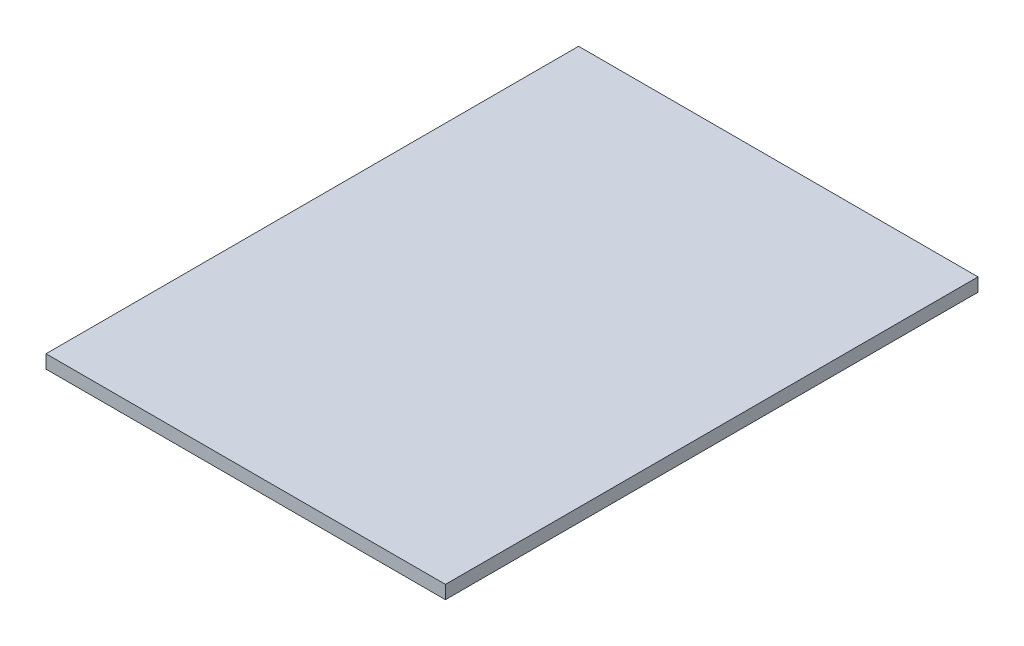
ISO-10303-21;
HEADER;
FILE_DESCRIPTION(('STEP AP214'),'2;1');
FILE_NAME('part.step','',(''),(''),'','','');
FILE_SCHEMA(('AUTOMOTIVE_DESIGN { 1 0 10303 214 1 1 1 1 }'));
ENDSEC;
DATA;
#1=APPLICATION_CONTEXT('core data for automotive mechanical design processes');
#2=APPLICATION_PROTOCOL_DEFINITION('international standard','automotive_design',2000,#1);
#3=PRODUCT_CONTEXT('',#1,'mechanical');
#4=PRODUCT('Part','Part','',(#3));
#5=PRODUCT_RELATED_PRODUCT_CATEGORY('part','',(#4));
#6=PRODUCT_DEFINITION_FORMATION('','',#4);
#7=PRODUCT_DEFINITION_CONTEXT('part definition',#1,'design');
#8=PRODUCT_DEFINITION('design','',#6,#7);
#9=PRODUCT_DEFINITION_SHAPE('','',#8);
#10=(LENGTH_UNIT() NAMED_UNIT(*) SI_UNIT(.MILLI.,.METRE.));
#11=(NAMED_UNIT(*) PLANE_ANGLE_UNIT() SI_UNIT($,.RADIAN.));
#12=(NAMED_UNIT(*) SI_UNIT($,.STERADIAN.) SOLID_ANGLE_UNIT());
#13=UNCERTAINTY_MEASURE_WITH_UNIT(LENGTH_MEASURE(1.E-05),#10,'distance_accuracy_value','');
#14=(GEOMETRIC_REPRESENTATION_CONTEXT(3) GLOBAL_UNCERTAINTY_ASSIGNED_CONTEXT((#13)) GLOBAL_UNIT_ASSIGNED_CONTEXT((#10,
#11,#12)) REPRESENTATION_CONTEXT('',''));
#15=CARTESIAN_POINT('',(0.,0.,0.));
#16=DIRECTION('',(0.,0.,1.));
#17=DIRECTION('',(1.,0.,0.));
#18=AXIS2_PLACEMENT_3D('',#15,#16,#17);
#19=CARTESIAN_POINT('',(0.,20.,0.));
#20=DIRECTION('',(1.,0.,0.));
#21=DIRECTION('',(0.,0.,-1.));
#22=AXIS2_PLACEMENT_3D('',#19,#20,#21);
#23=PLANE('',#22);
#24=DIRECTION('',(0.,0.,1.));
#25=VECTOR('',#24,1.);
#26=CARTESIAN_POINT('',(0.,0.,0.));
#27=LINE('',#26,#25);
#28=CARTESIAN_POINT('',(-1.11022302462516E-13,0.,-800.));
#29=VERTEX_POINT('',#28);
#30=CARTESIAN_POINT('',(0.,0.,0.));
#31=VERTEX_POINT('',#30);
#32=EDGE_CURVE('E95',#29,#31,#27,.T.);
#33=ORIENTED_EDGE('',*,*,#32,.T.);
#34=DIRECTION('',(0.,-1.,0.));
#35=VECTOR('',#34,1.);
#36=CARTESIAN_POINT('',(0.,20.,0.));
#37=LINE('',#36,#35);
#38=CARTESIAN_POINT('',(0.,20.,0.));
#39=VERTEX_POINT('',#38);
#40=EDGE_CURVE('E11',#39,#31,#37,.T.);
#41=ORIENTED_EDGE('',*,*,#40,.F.);
#42=DIRECTION('',(0.,0.,1.));
#43=VECTOR('',#42,1.);
#44=CARTESIAN_POINT('',(0.,20.,0.));
#45=LINE('',#44,#43);
#46=CARTESIAN_POINT('',(-1.11022302462516E-13,20.,-800.));
#47=VERTEX_POINT('',#46);
#48=EDGE_CURVE('E83',#47,#39,#45,.T.);
#49=ORIENTED_EDGE('',*,*,#48,.F.);
#50=DIRECTION('',(0.,-1.,0.));
#51=VECTOR('',#50,1.);
#52=CARTESIAN_POINT('',(-1.11022302462516E-13,20.,-800.));
#53=LINE('',#52,#51);
#54=EDGE_CURVE('E91',#47,#29,#53,.T.);
#55=ORIENTED_EDGE('',*,*,#54,.T.);
#56=EDGE_LOOP('',(#33,#41,#49,#55));
#57=FACE_BOUND('',#56,.T.);
#58=ADVANCED_FACE('F32',(#57),#23,.F.);
#59=CARTESIAN_POINT('',(0.,20.,0.));
#60=DIRECTION('',(0.,0.,-1.));
#61=DIRECTION('',(-1.,0.,0.));
#62=AXIS2_PLACEMENT_3D('',#59,#60,#61);
#63=PLANE('',#62);
#64=DIRECTION('',(1.,0.,0.));
#65=VECTOR('',#64,1.);
#66=CARTESIAN_POINT('',(0.,0.,0.));
#67=LINE('',#66,#65);
#68=CARTESIAN_POINT('',(600.,0.,0.));
#69=VERTEX_POINT('',#68);
#70=EDGE_CURVE('E87',#31,#69,#67,.T.);
#71=ORIENTED_EDGE('',*,*,#70,.T.);
#72=DIRECTION('',(0.,-1.,0.));
#73=VECTOR('',#72,1.);
#74=CARTESIAN_POINT('',(600.,20.,0.));
#75=LINE('',#74,#73);
#76=CARTESIAN_POINT('',(600.,20.,0.));
#77=VERTEX_POINT('',#76);
#78=EDGE_CURVE('E40',#77,#69,#75,.T.);
#79=ORIENTED_EDGE('',*,*,#78,.F.);
#80=DIRECTION('',(1.,0.,0.));
#81=VECTOR('',#80,1.);
#82=CARTESIAN_POINT('',(0.,20.,0.));
#83=LINE('',#82,#81);
#84=EDGE_CURVE('E78',#39,#77,#83,.T.);
#85=ORIENTED_EDGE('',*,*,#84,.F.);
#86=ORIENTED_EDGE('',*,*,#40,.T.);
#87=EDGE_LOOP('',(#71,#79,#85,#86));
#88=FACE_BOUND('',#87,.T.);
#89=ADVANCED_FACE('F86',(#88),#63,.F.);
#90=CARTESIAN_POINT('',(600.,20.,0.));
#91=DIRECTION('',(-1.,0.,0.));
#92=DIRECTION('',(0.,0.,1.));
#93=AXIS2_PLACEMENT_3D('',#90,#91,#92);
#94=PLANE('',#93);
#95=DIRECTION('',(0.,0.,-1.));
#96=VECTOR('',#95,1.);
#97=CARTESIAN_POINT('',(600.,0.,0.));
#98=LINE('',#97,#96);
#99=CARTESIAN_POINT('',(600.,0.,-800.));
#100=VERTEX_POINT('',#99);
#101=EDGE_CURVE('E65',#69,#100,#98,.T.);
#102=ORIENTED_EDGE('',*,*,#101,.T.);
#103=DIRECTION('',(0.,-1.,0.));
#104=VECTOR('',#103,1.);
#105=CARTESIAN_POINT('',(600.,20.,-800.));
#106=LINE('',#105,#104);
#107=CARTESIAN_POINT('',(600.,20.,-800.));
#108=VERTEX_POINT('',#107);
#109=EDGE_CURVE('E88',#108,#100,#106,.T.);
#110=ORIENTED_EDGE('',*,*,#109,.F.);
#111=DIRECTION('',(0.,0.,-1.));
#112=VECTOR('',#111,1.);
#113=CARTESIAN_POINT('',(600.,20.,0.));
#114=LINE('',#113,#112);
#115=EDGE_CURVE('E81',#77,#108,#114,.T.);
#116=ORIENTED_EDGE('',*,*,#115,.F.);
#117=ORIENTED_EDGE('',*,*,#78,.T.);
#118=EDGE_LOOP('',(#102,#110,#116,#117));
#119=FACE_BOUND('',#118,.T.);
#120=ADVANCED_FACE('F89',(#119),#94,.F.);
#121=CARTESIAN_POINT('',(-1.11022302462516E-13,20.,-800.));
#122=DIRECTION('',(0.,0.,1.));
#123=DIRECTION('',(1.,0.,0.));
#124=AXIS2_PLACEMENT_3D('',#121,#122,#123);
#125=PLANE('',#124);
#126=DIRECTION('',(-1.,0.,0.));
#127=VECTOR('',#126,1.);
#128=CARTESIAN_POINT('',(-1.11022302462516E-13,0.,-800.));
#129=LINE('',#128,#127);
#130=EDGE_CURVE('E71',#100,#29,#129,.T.);
#131=ORIENTED_EDGE('',*,*,#130,.T.);
#132=ORIENTED_EDGE('',*,*,#54,.F.);
#133=DIRECTION('',(-1.,0.,0.));
#134=VECTOR('',#133,1.);
#135=CARTESIAN_POINT('',(-1.11022302462516E-13,20.,-800.));
#136=LINE('',#135,#134);
#137=EDGE_CURVE('E48',#108,#47,#136,.T.);
#138=ORIENTED_EDGE('',*,*,#137,.F.);
#139=ORIENTED_EDGE('',*,*,#109,.T.);
#140=EDGE_LOOP('',(#131,#132,#138,#139));
#141=FACE_BOUND('',#140,.T.);
#142=ADVANCED_FACE('F102',(#141),#125,.F.);
#143=CARTESIAN_POINT('',(0.,20.,0.));
#144=DIRECTION('',(0.,-1.,0.));
#145=DIRECTION('',(0.,0.,-1.));
#146=AXIS2_PLACEMENT_3D('',#143,#144,#145);
#147=PLANE('',#146);
#148=ORIENTED_EDGE('',*,*,#48,.T.);
#149=ORIENTED_EDGE('',*,*,#84,.T.);
#150=ORIENTED_EDGE('',*,*,#115,.T.);
#151=ORIENTED_EDGE('',*,*,#137,.T.);
#152=EDGE_LOOP('',(#148,#149,#150,#151));
#153=FACE_BOUND('',#152,.T.);
#154=ADVANCED_FACE('F79',(#153),#147,.F.);
#155=CARTESIAN_POINT('',(0.,0.,0.));
#156=DIRECTION('',(0.,-1.,0.));
#157=DIRECTION('',(0.,0.,-1.));
#158=AXIS2_PLACEMENT_3D('',#155,#156,#157);
#159=PLANE('',#158);
#160=ORIENTED_EDGE('',*,*,#32,.F.);
#161=ORIENTED_EDGE('',*,*,#130,.F.);
#162=ORIENTED_EDGE('',*,*,#101,.F.);
#163=ORIENTED_EDGE('',*,*,#70,.F.);
#164=EDGE_LOOP('',(#160,#161,#162,#163));
#165=FACE_BOUND('',#164,.T.);
#166=ADVANCED_FACE('F105',(#165),#159,.T.);
#167=CLOSED_SHELL('',(#58,#89,#120,#142,#154,#166));
#168=MANIFOLD_SOLID_BREP('B2',#167);
#169=ADVANCED_BREP_SHAPE_REPRESENTATION('',(#18,#168),#14);
#170=SHAPE_DEFINITION_REPRESENTATION(#9,#169);
ENDSEC;
END-ISO-10303-21;
